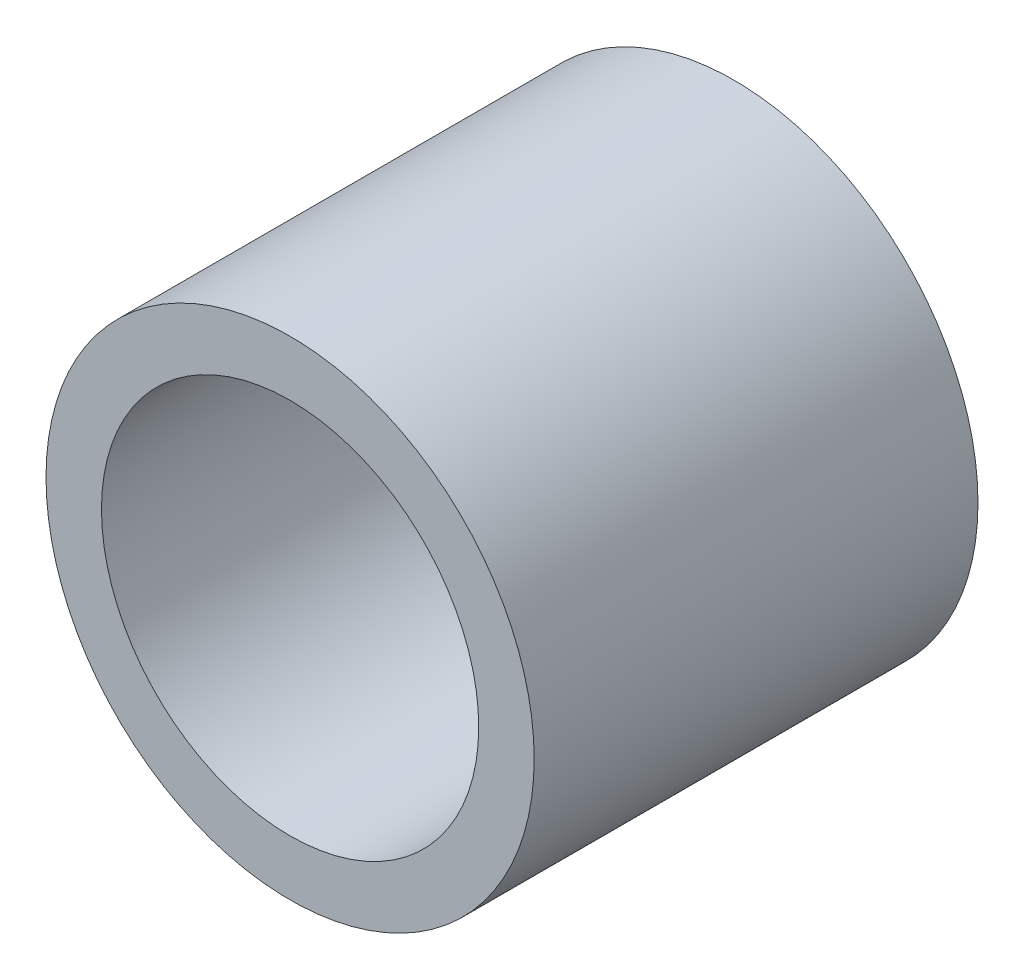
ISO-10303-21;
HEADER;
FILE_DESCRIPTION(('STEP AP214'),'2;1');
FILE_NAME('part.step','',(''),(''),'','','');
FILE_SCHEMA(('AUTOMOTIVE_DESIGN { 1 0 10303 214 1 1 1 1 }'));
ENDSEC;
DATA;
#1=APPLICATION_CONTEXT('core data for automotive mechanical design processes');
#2=APPLICATION_PROTOCOL_DEFINITION('international standard','automotive_design',2000,#1);
#3=PRODUCT_CONTEXT('',#1,'mechanical');
#4=PRODUCT('Part','Part','',(#3));
#5=PRODUCT_RELATED_PRODUCT_CATEGORY('part','',(#4));
#6=PRODUCT_DEFINITION_FORMATION('','',#4);
#7=PRODUCT_DEFINITION_CONTEXT('part definition',#1,'design');
#8=PRODUCT_DEFINITION('design','',#6,#7);
#9=PRODUCT_DEFINITION_SHAPE('','',#8);
#10=(LENGTH_UNIT() NAMED_UNIT(*) SI_UNIT(.MILLI.,.METRE.));
#11=(NAMED_UNIT(*) PLANE_ANGLE_UNIT() SI_UNIT($,.RADIAN.));
#12=(NAMED_UNIT(*) SI_UNIT($,.STERADIAN.) SOLID_ANGLE_UNIT());
#13=UNCERTAINTY_MEASURE_WITH_UNIT(LENGTH_MEASURE(1.E-05),#10,'distance_accuracy_value','');
#14=(GEOMETRIC_REPRESENTATION_CONTEXT(3) GLOBAL_UNCERTAINTY_ASSIGNED_CONTEXT((#13)) GLOBAL_UNIT_ASSIGNED_CONTEXT((#10,
#11,#12)) REPRESENTATION_CONTEXT('',''));
#15=CARTESIAN_POINT('',(0.,0.,0.));
#16=DIRECTION('',(0.,0.,1.));
#17=DIRECTION('',(1.,0.,0.));
#18=AXIS2_PLACEMENT_3D('',#15,#16,#17);
#19=CARTESIAN_POINT('',(0.,0.,40.));
#20=DIRECTION('',(0.,0.,1.));
#21=DIRECTION('',(1.,0.,0.));
#22=AXIS2_PLACEMENT_3D('',#19,#20,#21);
#23=PLANE('',#22);
#24=CARTESIAN_POINT('',(0.,0.,40.));
#25=DIRECTION('',(0.,0.,1.));
#26=DIRECTION('',(1.,0.,0.));
#27=AXIS2_PLACEMENT_3D('',#24,#25,#26);
#28=CIRCLE('',#27,22.);
#29=CARTESIAN_POINT('',(22.,0.,40.));
#30=VERTEX_POINT('',#29);
#31=EDGE_CURVE('E10',#30,#30,#28,.T.);
#32=ORIENTED_EDGE('',*,*,#31,.T.);
#33=EDGE_LOOP('',(#32));
#34=FACE_BOUND('',#33,.T.);
#35=CARTESIAN_POINT('',(0.,0.,40.));
#36=DIRECTION('',(0.,0.,1.));
#37=DIRECTION('',(1.,0.,0.));
#38=AXIS2_PLACEMENT_3D('',#35,#36,#37);
#39=CIRCLE('',#38,17.);
#40=CARTESIAN_POINT('',(17.,0.,40.));
#41=VERTEX_POINT('',#40);
#42=EDGE_CURVE('E50',#41,#41,#39,.T.);
#43=ORIENTED_EDGE('',*,*,#42,.F.);
#44=EDGE_LOOP('',(#43));
#45=FACE_BOUND('',#44,.T.);
#46=ADVANCED_FACE('F37',(#34,#45),#23,.T.);
#47=CARTESIAN_POINT('',(0.,0.,0.));
#48=DIRECTION('',(0.,0.,1.));
#49=DIRECTION('',(1.,0.,0.));
#50=AXIS2_PLACEMENT_3D('',#47,#48,#49);
#51=PLANE('',#50);
#52=CARTESIAN_POINT('',(0.,0.,0.));
#53=DIRECTION('',(0.,0.,1.));
#54=DIRECTION('',(1.,0.,0.));
#55=AXIS2_PLACEMENT_3D('',#52,#53,#54);
#56=CIRCLE('',#55,22.);
#57=CARTESIAN_POINT('',(22.,0.,0.));
#58=VERTEX_POINT('',#57);
#59=EDGE_CURVE('E41',#58,#58,#56,.T.);
#60=ORIENTED_EDGE('',*,*,#59,.F.);
#61=EDGE_LOOP('',(#60));
#62=FACE_BOUND('',#61,.T.);
#63=CARTESIAN_POINT('',(0.,0.,0.));
#64=DIRECTION('',(0.,0.,1.));
#65=DIRECTION('',(1.,0.,0.));
#66=AXIS2_PLACEMENT_3D('',#63,#64,#65);
#67=CIRCLE('',#66,17.);
#68=CARTESIAN_POINT('',(17.,0.,0.));
#69=VERTEX_POINT('',#68);
#70=EDGE_CURVE('E52',#69,#69,#67,.T.);
#71=ORIENTED_EDGE('',*,*,#70,.T.);
#72=EDGE_LOOP('',(#71));
#73=FACE_BOUND('',#72,.T.);
#74=ADVANCED_FACE('F64',(#62,#73),#51,.F.);
#75=CARTESIAN_POINT('',(0.,0.,40.));
#76=DIRECTION('',(0.,0.,-1.));
#77=DIRECTION('',(-1.,0.,0.));
#78=AXIS2_PLACEMENT_3D('',#75,#76,#77);
#79=CYLINDRICAL_SURFACE('',#78,22.);
#80=ORIENTED_EDGE('',*,*,#31,.F.);
#81=EDGE_LOOP('',(#80));
#82=FACE_BOUND('',#81,.T.);
#83=ORIENTED_EDGE('',*,*,#59,.T.);
#84=EDGE_LOOP('',(#83));
#85=FACE_BOUND('',#84,.T.);
#86=ADVANCED_FACE('F39',(#82,#85),#79,.T.);
#87=CARTESIAN_POINT('',(0.,0.,40.));
#88=DIRECTION('',(0.,0.,-1.));
#89=DIRECTION('',(-1.,0.,0.));
#90=AXIS2_PLACEMENT_3D('',#87,#88,#89);
#91=CYLINDRICAL_SURFACE('',#90,17.);
#92=ORIENTED_EDGE('',*,*,#42,.T.);
#93=EDGE_LOOP('',(#92));
#94=FACE_BOUND('',#93,.T.);
#95=ORIENTED_EDGE('',*,*,#70,.F.);
#96=EDGE_LOOP('',(#95));
#97=FACE_BOUND('',#96,.T.);
#98=ADVANCED_FACE('F60',(#94,#97),#91,.F.);
#99=CLOSED_SHELL('',(#46,#74,#86,#98));
#100=MANIFOLD_SOLID_BREP('B2',#99);
#101=ADVANCED_BREP_SHAPE_REPRESENTATION('',(#18,#100),#14);
#102=SHAPE_DEFINITION_REPRESENTATION(#9,#101);
ENDSEC;
END-ISO-10303-21;
